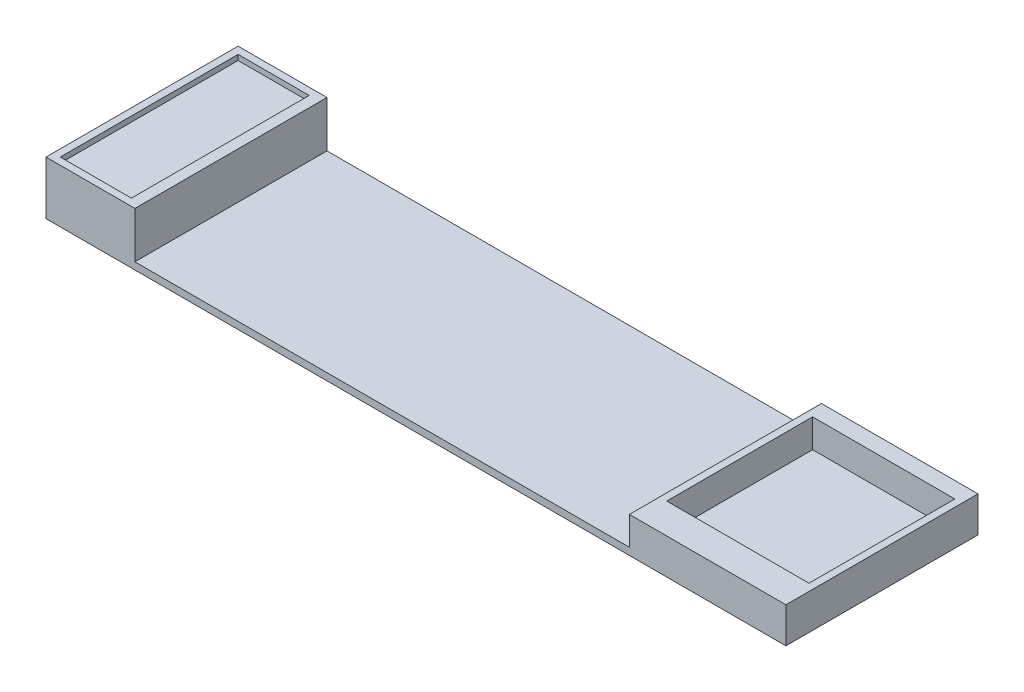
ISO-10303-21;
HEADER;
FILE_DESCRIPTION(('STEP AP214'),'2;1');
FILE_NAME('part.step','',(''),(''),'','','');
FILE_SCHEMA(('AUTOMOTIVE_DESIGN { 1 0 10303 214 1 1 1 1 }'));
ENDSEC;
DATA;
#1=APPLICATION_CONTEXT('core data for automotive mechanical design processes');
#2=APPLICATION_PROTOCOL_DEFINITION('international standard','automotive_design',2000,#1);
#3=PRODUCT_CONTEXT('',#1,'mechanical');
#4=PRODUCT('Part','Part','',(#3));
#5=PRODUCT_RELATED_PRODUCT_CATEGORY('part','',(#4));
#6=PRODUCT_DEFINITION_FORMATION('','',#4);
#7=PRODUCT_DEFINITION_CONTEXT('part definition',#1,'design');
#8=PRODUCT_DEFINITION('design','',#6,#7);
#9=PRODUCT_DEFINITION_SHAPE('','',#8);
#10=(LENGTH_UNIT() NAMED_UNIT(*) SI_UNIT(.MILLI.,.METRE.));
#11=(NAMED_UNIT(*) PLANE_ANGLE_UNIT() SI_UNIT($,.RADIAN.));
#12=(NAMED_UNIT(*) SI_UNIT($,.STERADIAN.) SOLID_ANGLE_UNIT());
#13=UNCERTAINTY_MEASURE_WITH_UNIT(LENGTH_MEASURE(1.E-05),#10,'distance_accuracy_value','');
#14=(GEOMETRIC_REPRESENTATION_CONTEXT(3) GLOBAL_UNCERTAINTY_ASSIGNED_CONTEXT((#13)) GLOBAL_UNIT_ASSIGNED_CONTEXT((#10,
#11,#12)) REPRESENTATION_CONTEXT('',''));
#15=CARTESIAN_POINT('',(0.,0.,0.));
#16=DIRECTION('',(0.,0.,1.));
#17=DIRECTION('',(1.,0.,0.));
#18=AXIS2_PLACEMENT_3D('',#15,#16,#17);
#19=CARTESIAN_POINT('',(0.,10.,0.));
#20=DIRECTION('',(0.,1.,0.));
#21=DIRECTION('',(0.,0.,1.));
#22=AXIS2_PLACEMENT_3D('',#19,#20,#21);
#23=PLANE('',#22);
#24=DIRECTION('',(0.,0.,1.));
#25=VECTOR('',#24,1.);
#26=CARTESIAN_POINT('',(62.,10.,18.5));
#27=LINE('',#26,#25);
#28=CARTESIAN_POINT('',(62.,10.,-22.5));
#29=VERTEX_POINT('',#28);
#30=CARTESIAN_POINT('',(62.,10.,18.5));
#31=VERTEX_POINT('',#30);
#32=EDGE_CURVE('E63',#29,#31,#27,.T.);
#33=ORIENTED_EDGE('',*,*,#32,.F.);
#34=DIRECTION('',(-1.,0.,0.));
#35=VECTOR('',#34,1.);
#36=CARTESIAN_POINT('',(102.,10.,-22.5));
#37=LINE('',#36,#35);
#38=CARTESIAN_POINT('',(102.,10.,-22.5));
#39=VERTEX_POINT('',#38);
#40=EDGE_CURVE('E224',#39,#29,#37,.T.);
#41=ORIENTED_EDGE('',*,*,#40,.F.);
#42=DIRECTION('',(0.,0.,-1.));
#43=VECTOR('',#42,1.);
#44=CARTESIAN_POINT('',(102.,10.,18.5));
#45=LINE('',#44,#43);
#46=CARTESIAN_POINT('',(102.,10.,18.5));
#47=VERTEX_POINT('',#46);
#48=EDGE_CURVE('E243',#47,#39,#45,.T.);
#49=ORIENTED_EDGE('',*,*,#48,.F.);
#50=DIRECTION('',(1.,0.,0.));
#51=VECTOR('',#50,1.);
#52=CARTESIAN_POINT('',(102.,10.,18.5));
#53=LINE('',#52,#51);
#54=EDGE_CURVE('E239',#31,#47,#53,.T.);
#55=ORIENTED_EDGE('',*,*,#54,.F.);
#56=EDGE_LOOP('',(#33,#41,#49,#55));
#57=FACE_BOUND('',#56,.T.);
#58=DIRECTION('',(0.,0.,-1.));
#59=VECTOR('',#58,1.);
#60=CARTESIAN_POINT('',(60.,10.,27.));
#61=LINE('',#60,#59);
#62=CARTESIAN_POINT('',(60.,10.,27.));
#63=VERTEX_POINT('',#62);
#64=CARTESIAN_POINT('',(60.,10.,-27.));
#65=VERTEX_POINT('',#64);
#66=EDGE_CURVE('E253',#63,#65,#61,.T.);
#67=ORIENTED_EDGE('',*,*,#66,.F.);
#68=DIRECTION('',(1.,0.,0.));
#69=VECTOR('',#68,1.);
#70=CARTESIAN_POINT('',(104.,10.,27.));
#71=LINE('',#70,#69);
#72=CARTESIAN_POINT('',(104.,10.,27.));
#73=VERTEX_POINT('',#72);
#74=EDGE_CURVE('E294',#63,#73,#71,.T.);
#75=ORIENTED_EDGE('',*,*,#74,.T.);
#76=DIRECTION('',(0.,0.,-1.));
#77=VECTOR('',#76,1.);
#78=CARTESIAN_POINT('',(104.,10.,27.));
#79=LINE('',#78,#77);
#80=CARTESIAN_POINT('',(104.,10.,-27.));
#81=VERTEX_POINT('',#80);
#82=EDGE_CURVE('E297',#73,#81,#79,.T.);
#83=ORIENTED_EDGE('',*,*,#82,.T.);
#84=DIRECTION('',(-1.,0.,0.));
#85=VECTOR('',#84,1.);
#86=CARTESIAN_POINT('',(104.,10.,-27.));
#87=LINE('',#86,#85);
#88=EDGE_CURVE('E301',#81,#65,#87,.T.);
#89=ORIENTED_EDGE('',*,*,#88,.T.);
#90=EDGE_LOOP('',(#67,#75,#83,#89));
#91=FACE_BOUND('',#90,.T.);
#92=ADVANCED_FACE('F39',(#57,#91),#23,.T.);
#93=CARTESIAN_POINT('',(-104.,10.,27.));
#94=DIRECTION('',(1.,0.,0.));
#95=DIRECTION('',(0.,0.,-1.));
#96=AXIS2_PLACEMENT_3D('',#93,#94,#95);
#97=PLANE('',#96);
#98=DIRECTION('',(0.,0.,1.));
#99=VECTOR('',#98,1.);
#100=CARTESIAN_POINT('',(-104.,0.,27.));
#101=LINE('',#100,#99);
#102=CARTESIAN_POINT('',(-104.,0.,-27.));
#103=VERTEX_POINT('',#102);
#104=CARTESIAN_POINT('',(-104.,0.,27.));
#105=VERTEX_POINT('',#104);
#106=EDGE_CURVE('E284',#103,#105,#101,.T.);
#107=ORIENTED_EDGE('',*,*,#106,.T.);
#108=DIRECTION('',(0.,-1.,0.));
#109=VECTOR('',#108,1.);
#110=CARTESIAN_POINT('',(-104.,10.,27.));
#111=LINE('',#110,#109);
#112=CARTESIAN_POINT('',(-104.,15.,27.));
#113=VERTEX_POINT('',#112);
#114=EDGE_CURVE('E11',#113,#105,#111,.T.);
#115=ORIENTED_EDGE('',*,*,#114,.F.);
#116=DIRECTION('',(0.,0.,1.));
#117=VECTOR('',#116,1.);
#118=CARTESIAN_POINT('',(-104.,15.,27.));
#119=LINE('',#118,#117);
#120=CARTESIAN_POINT('',(-104.,15.,-27.));
#121=VERTEX_POINT('',#120);
#122=EDGE_CURVE('E198',#121,#113,#119,.T.);
#123=ORIENTED_EDGE('',*,*,#122,.F.);
#124=DIRECTION('',(0.,-1.,0.));
#125=VECTOR('',#124,1.);
#126=CARTESIAN_POINT('',(-104.,10.,-27.));
#127=LINE('',#126,#125);
#128=EDGE_CURVE('E305',#121,#103,#127,.T.);
#129=ORIENTED_EDGE('',*,*,#128,.T.);
#130=EDGE_LOOP('',(#107,#115,#123,#129));
#131=FACE_BOUND('',#130,.T.);
#132=ADVANCED_FACE('F41',(#131),#97,.F.);
#133=CARTESIAN_POINT('',(104.,10.,27.));
#134=DIRECTION('',(0.,0.,-1.));
#135=DIRECTION('',(-1.,0.,0.));
#136=AXIS2_PLACEMENT_3D('',#133,#134,#135);
#137=PLANE('',#136);
#138=ORIENTED_EDGE('',*,*,#74,.F.);
#139=DIRECTION('',(0.,1.,0.));
#140=VECTOR('',#139,1.);
#141=CARTESIAN_POINT('',(60.,2.,27.));
#142=LINE('',#141,#140);
#143=CARTESIAN_POINT('',(60.,2.,27.));
#144=VERTEX_POINT('',#143);
#145=EDGE_CURVE('E281',#144,#63,#142,.T.);
#146=ORIENTED_EDGE('',*,*,#145,.F.);
#147=DIRECTION('',(1.,0.,0.));
#148=VECTOR('',#147,1.);
#149=CARTESIAN_POINT('',(-79.,2.,27.));
#150=LINE('',#149,#148);
#151=CARTESIAN_POINT('',(-79.,2.,27.));
#152=VERTEX_POINT('',#151);
#153=EDGE_CURVE('E274',#152,#144,#150,.T.);
#154=ORIENTED_EDGE('',*,*,#153,.F.);
#155=DIRECTION('',(0.,1.,0.));
#156=VECTOR('',#155,1.);
#157=CARTESIAN_POINT('',(-79.,2.,27.));
#158=LINE('',#157,#156);
#159=CARTESIAN_POINT('',(-79.,15.,27.));
#160=VERTEX_POINT('',#159);
#161=EDGE_CURVE('E285',#152,#160,#158,.T.);
#162=ORIENTED_EDGE('',*,*,#161,.T.);
#163=DIRECTION('',(1.,0.,0.));
#164=VECTOR('',#163,1.);
#165=CARTESIAN_POINT('',(-79.,15.,27.));
#166=LINE('',#165,#164);
#167=EDGE_CURVE('E207',#113,#160,#166,.T.);
#168=ORIENTED_EDGE('',*,*,#167,.F.);
#169=ORIENTED_EDGE('',*,*,#114,.T.);
#170=DIRECTION('',(1.,0.,0.));
#171=VECTOR('',#170,1.);
#172=CARTESIAN_POINT('',(104.,0.,27.));
#173=LINE('',#172,#171);
#174=CARTESIAN_POINT('',(104.,0.,27.));
#175=VERTEX_POINT('',#174);
#176=EDGE_CURVE('E309',#105,#175,#173,.T.);
#177=ORIENTED_EDGE('',*,*,#176,.T.);
#178=DIRECTION('',(0.,-1.,0.));
#179=VECTOR('',#178,1.);
#180=CARTESIAN_POINT('',(104.,10.,27.));
#181=LINE('',#180,#179);
#182=EDGE_CURVE('E48',#73,#175,#181,.T.);
#183=ORIENTED_EDGE('',*,*,#182,.F.);
#184=EDGE_LOOP('',(#138,#146,#154,#162,#168,#169,#177,#183));
#185=FACE_BOUND('',#184,.T.);
#186=ADVANCED_FACE('F359',(#185),#137,.F.);
#187=CARTESIAN_POINT('',(104.,10.,27.));
#188=DIRECTION('',(-1.,0.,0.));
#189=DIRECTION('',(0.,0.,1.));
#190=AXIS2_PLACEMENT_3D('',#187,#188,#189);
#191=PLANE('',#190);
#192=DIRECTION('',(0.,0.,-1.));
#193=VECTOR('',#192,1.);
#194=CARTESIAN_POINT('',(104.,0.,27.));
#195=LINE('',#194,#193);
#196=CARTESIAN_POINT('',(104.,0.,-27.));
#197=VERTEX_POINT('',#196);
#198=EDGE_CURVE('E312',#175,#197,#195,.T.);
#199=ORIENTED_EDGE('',*,*,#198,.T.);
#200=DIRECTION('',(0.,-1.,0.));
#201=VECTOR('',#200,1.);
#202=CARTESIAN_POINT('',(104.,10.,-27.));
#203=LINE('',#202,#201);
#204=EDGE_CURVE('E320',#81,#197,#203,.T.);
#205=ORIENTED_EDGE('',*,*,#204,.F.);
#206=ORIENTED_EDGE('',*,*,#82,.F.);
#207=ORIENTED_EDGE('',*,*,#182,.T.);
#208=EDGE_LOOP('',(#199,#205,#206,#207));
#209=FACE_BOUND('',#208,.T.);
#210=ADVANCED_FACE('F329',(#209),#191,.F.);
#211=CARTESIAN_POINT('',(104.,10.,-27.));
#212=DIRECTION('',(0.,0.,1.));
#213=DIRECTION('',(1.,0.,0.));
#214=AXIS2_PLACEMENT_3D('',#211,#212,#213);
#215=PLANE('',#214);
#216=DIRECTION('',(-1.,0.,0.));
#217=VECTOR('',#216,1.);
#218=CARTESIAN_POINT('',(60.,2.,-27.));
#219=LINE('',#218,#217);
#220=CARTESIAN_POINT('',(60.,2.,-27.));
#221=VERTEX_POINT('',#220);
#222=CARTESIAN_POINT('',(-79.,2.,-27.));
#223=VERTEX_POINT('',#222);
#224=EDGE_CURVE('E266',#221,#223,#219,.T.);
#225=ORIENTED_EDGE('',*,*,#224,.F.);
#226=DIRECTION('',(0.,1.,0.));
#227=VECTOR('',#226,1.);
#228=CARTESIAN_POINT('',(60.,2.,-27.));
#229=LINE('',#228,#227);
#230=EDGE_CURVE('E278',#221,#65,#229,.T.);
#231=ORIENTED_EDGE('',*,*,#230,.T.);
#232=ORIENTED_EDGE('',*,*,#88,.F.);
#233=ORIENTED_EDGE('',*,*,#204,.T.);
#234=DIRECTION('',(-1.,0.,0.));
#235=VECTOR('',#234,1.);
#236=CARTESIAN_POINT('',(104.,0.,-27.));
#237=LINE('',#236,#235);
#238=EDGE_CURVE('E298',#197,#103,#237,.T.);
#239=ORIENTED_EDGE('',*,*,#238,.T.);
#240=ORIENTED_EDGE('',*,*,#128,.F.);
#241=DIRECTION('',(-1.,0.,0.));
#242=VECTOR('',#241,1.);
#243=CARTESIAN_POINT('',(-104.,15.,-27.));
#244=LINE('',#243,#242);
#245=CARTESIAN_POINT('',(-79.,15.,-27.));
#246=VERTEX_POINT('',#245);
#247=EDGE_CURVE('E215',#246,#121,#244,.T.);
#248=ORIENTED_EDGE('',*,*,#247,.F.);
#249=DIRECTION('',(0.,1.,0.));
#250=VECTOR('',#249,1.);
#251=CARTESIAN_POINT('',(-79.,2.,-27.));
#252=LINE('',#251,#250);
#253=EDGE_CURVE('E288',#223,#246,#252,.T.);
#254=ORIENTED_EDGE('',*,*,#253,.F.);
#255=EDGE_LOOP('',(#225,#231,#232,#233,#239,#240,#248,#254));
#256=FACE_BOUND('',#255,.T.);
#257=ADVANCED_FACE('F339',(#256),#215,.F.);
#258=CARTESIAN_POINT('',(0.,0.,0.));
#259=DIRECTION('',(0.,1.,0.));
#260=DIRECTION('',(0.,0.,1.));
#261=AXIS2_PLACEMENT_3D('',#258,#259,#260);
#262=PLANE('',#261);
#263=ORIENTED_EDGE('',*,*,#106,.F.);
#264=ORIENTED_EDGE('',*,*,#238,.F.);
#265=ORIENTED_EDGE('',*,*,#198,.F.);
#266=ORIENTED_EDGE('',*,*,#176,.F.);
#267=EDGE_LOOP('',(#263,#264,#265,#266));
#268=FACE_BOUND('',#267,.T.);
#269=ADVANCED_FACE('F336',(#268),#262,.F.);
#270=CARTESIAN_POINT('',(60.,2.,27.));
#271=DIRECTION('',(1.,0.,0.));
#272=DIRECTION('',(0.,0.,-1.));
#273=AXIS2_PLACEMENT_3D('',#270,#271,#272);
#274=PLANE('',#273);
#275=ORIENTED_EDGE('',*,*,#66,.T.);
#276=ORIENTED_EDGE('',*,*,#230,.F.);
#277=DIRECTION('',(0.,0.,-1.));
#278=VECTOR('',#277,1.);
#279=CARTESIAN_POINT('',(60.,2.,27.));
#280=LINE('',#279,#278);
#281=EDGE_CURVE('E262',#144,#221,#280,.T.);
#282=ORIENTED_EDGE('',*,*,#281,.F.);
#283=ORIENTED_EDGE('',*,*,#145,.T.);
#284=EDGE_LOOP('',(#275,#276,#282,#283));
#285=FACE_BOUND('',#284,.T.);
#286=ADVANCED_FACE('F356',(#285),#274,.F.);
#287=CARTESIAN_POINT('',(-79.,2.,-27.));
#288=DIRECTION('',(-1.,0.,0.));
#289=DIRECTION('',(0.,0.,1.));
#290=AXIS2_PLACEMENT_3D('',#287,#288,#289);
#291=PLANE('',#290);
#292=ORIENTED_EDGE('',*,*,#253,.T.);
#293=DIRECTION('',(0.,0.,-1.));
#294=VECTOR('',#293,1.);
#295=CARTESIAN_POINT('',(-79.,15.,-27.));
#296=LINE('',#295,#294);
#297=EDGE_CURVE('E211',#160,#246,#296,.T.);
#298=ORIENTED_EDGE('',*,*,#297,.F.);
#299=ORIENTED_EDGE('',*,*,#161,.F.);
#300=DIRECTION('',(0.,0.,1.));
#301=VECTOR('',#300,1.);
#302=CARTESIAN_POINT('',(-79.,2.,-27.));
#303=LINE('',#302,#301);
#304=EDGE_CURVE('E270',#223,#152,#303,.T.);
#305=ORIENTED_EDGE('',*,*,#304,.F.);
#306=EDGE_LOOP('',(#292,#298,#299,#305));
#307=FACE_BOUND('',#306,.T.);
#308=ADVANCED_FACE('F350',(#307),#291,.F.);
#309=CARTESIAN_POINT('',(0.,2.,0.));
#310=DIRECTION('',(0.,1.,0.));
#311=DIRECTION('',(0.,0.,1.));
#312=AXIS2_PLACEMENT_3D('',#309,#310,#311);
#313=PLANE('',#312);
#314=ORIENTED_EDGE('',*,*,#281,.T.);
#315=ORIENTED_EDGE('',*,*,#224,.T.);
#316=ORIENTED_EDGE('',*,*,#304,.T.);
#317=ORIENTED_EDGE('',*,*,#153,.T.);
#318=EDGE_LOOP('',(#314,#315,#316,#317));
#319=FACE_BOUND('',#318,.T.);
#320=ADVANCED_FACE('F353',(#319),#313,.T.);
#321=CARTESIAN_POINT('',(62.,2.,18.5));
#322=DIRECTION('',(-1.,0.,0.));
#323=DIRECTION('',(0.,0.,1.));
#324=AXIS2_PLACEMENT_3D('',#321,#322,#323);
#325=PLANE('',#324);
#326=ORIENTED_EDGE('',*,*,#32,.T.);
#327=DIRECTION('',(0.,1.,0.));
#328=VECTOR('',#327,1.);
#329=CARTESIAN_POINT('',(62.,2.,18.5));
#330=LINE('',#329,#328);
#331=CARTESIAN_POINT('',(62.,2.,18.5));
#332=VERTEX_POINT('',#331);
#333=EDGE_CURVE('E236',#332,#31,#330,.T.);
#334=ORIENTED_EDGE('',*,*,#333,.F.);
#335=DIRECTION('',(0.,0.,1.));
#336=VECTOR('',#335,1.);
#337=CARTESIAN_POINT('',(62.,2.,18.5));
#338=LINE('',#337,#336);
#339=CARTESIAN_POINT('',(62.,2.,-22.5));
#340=VERTEX_POINT('',#339);
#341=EDGE_CURVE('E219',#340,#332,#338,.T.);
#342=ORIENTED_EDGE('',*,*,#341,.F.);
#343=DIRECTION('',(0.,1.,0.));
#344=VECTOR('',#343,1.);
#345=CARTESIAN_POINT('',(62.,2.,-22.5));
#346=LINE('',#345,#344);
#347=EDGE_CURVE('E250',#340,#29,#346,.T.);
#348=ORIENTED_EDGE('',*,*,#347,.T.);
#349=EDGE_LOOP('',(#326,#334,#342,#348));
#350=FACE_BOUND('',#349,.T.);
#351=ADVANCED_FACE('F402',(#350),#325,.F.);
#352=CARTESIAN_POINT('',(102.,2.,-22.5));
#353=DIRECTION('',(0.,0.,-1.));
#354=DIRECTION('',(-1.,0.,0.));
#355=AXIS2_PLACEMENT_3D('',#352,#353,#354);
#356=PLANE('',#355);
#357=ORIENTED_EDGE('',*,*,#40,.T.);
#358=ORIENTED_EDGE('',*,*,#347,.F.);
#359=DIRECTION('',(-1.,0.,0.));
#360=VECTOR('',#359,1.);
#361=CARTESIAN_POINT('',(102.,2.,-22.5));
#362=LINE('',#361,#360);
#363=CARTESIAN_POINT('',(102.,2.,-22.5));
#364=VERTEX_POINT('',#363);
#365=EDGE_CURVE('E232',#364,#340,#362,.T.);
#366=ORIENTED_EDGE('',*,*,#365,.F.);
#367=DIRECTION('',(0.,1.,0.));
#368=VECTOR('',#367,1.);
#369=CARTESIAN_POINT('',(102.,2.,-22.5));
#370=LINE('',#369,#368);
#371=EDGE_CURVE('E254',#364,#39,#370,.T.);
#372=ORIENTED_EDGE('',*,*,#371,.T.);
#373=EDGE_LOOP('',(#357,#358,#366,#372));
#374=FACE_BOUND('',#373,.T.);
#375=ADVANCED_FACE('F409',(#374),#356,.F.);
#376=CARTESIAN_POINT('',(102.,2.,18.5));
#377=DIRECTION('',(1.,0.,0.));
#378=DIRECTION('',(0.,0.,-1.));
#379=AXIS2_PLACEMENT_3D('',#376,#377,#378);
#380=PLANE('',#379);
#381=ORIENTED_EDGE('',*,*,#48,.T.);
#382=ORIENTED_EDGE('',*,*,#371,.F.);
#383=DIRECTION('',(0.,0.,-1.));
#384=VECTOR('',#383,1.);
#385=CARTESIAN_POINT('',(102.,2.,18.5));
#386=LINE('',#385,#384);
#387=CARTESIAN_POINT('',(102.,2.,18.5));
#388=VERTEX_POINT('',#387);
#389=EDGE_CURVE('E228',#388,#364,#386,.T.);
#390=ORIENTED_EDGE('',*,*,#389,.F.);
#391=DIRECTION('',(0.,1.,0.));
#392=VECTOR('',#391,1.);
#393=CARTESIAN_POINT('',(102.,2.,18.5));
#394=LINE('',#393,#392);
#395=EDGE_CURVE('E257',#388,#47,#394,.T.);
#396=ORIENTED_EDGE('',*,*,#395,.T.);
#397=EDGE_LOOP('',(#381,#382,#390,#396));
#398=FACE_BOUND('',#397,.T.);
#399=ADVANCED_FACE('F416',(#398),#380,.F.);
#400=CARTESIAN_POINT('',(102.,2.,18.5));
#401=DIRECTION('',(0.,0.,1.));
#402=DIRECTION('',(1.,0.,0.));
#403=AXIS2_PLACEMENT_3D('',#400,#401,#402);
#404=PLANE('',#403);
#405=ORIENTED_EDGE('',*,*,#54,.T.);
#406=ORIENTED_EDGE('',*,*,#395,.F.);
#407=DIRECTION('',(1.,0.,0.));
#408=VECTOR('',#407,1.);
#409=CARTESIAN_POINT('',(102.,2.,18.5));
#410=LINE('',#409,#408);
#411=EDGE_CURVE('E223',#332,#388,#410,.T.);
#412=ORIENTED_EDGE('',*,*,#411,.F.);
#413=ORIENTED_EDGE('',*,*,#333,.T.);
#414=EDGE_LOOP('',(#405,#406,#412,#413));
#415=FACE_BOUND('',#414,.T.);
#416=ADVANCED_FACE('F424',(#415),#404,.F.);
#417=CARTESIAN_POINT('',(0.,2.,0.));
#418=DIRECTION('',(0.,1.,0.));
#419=DIRECTION('',(0.,0.,1.));
#420=AXIS2_PLACEMENT_3D('',#417,#418,#419);
#421=PLANE('',#420);
#422=ORIENTED_EDGE('',*,*,#341,.T.);
#423=ORIENTED_EDGE('',*,*,#411,.T.);
#424=ORIENTED_EDGE('',*,*,#389,.T.);
#425=ORIENTED_EDGE('',*,*,#365,.T.);
#426=EDGE_LOOP('',(#422,#423,#424,#425));
#427=FACE_BOUND('',#426,.T.);
#428=ADVANCED_FACE('F432',(#427),#421,.T.);
#429=CARTESIAN_POINT('',(0.,15.,0.));
#430=DIRECTION('',(0.,-1.,0.));
#431=DIRECTION('',(0.,0.,-1.));
#432=AXIS2_PLACEMENT_3D('',#429,#430,#431);
#433=PLANE('',#432);
#434=DIRECTION('',(-1.,0.,0.));
#435=VECTOR('',#434,1.);
#436=CARTESIAN_POINT('',(-102.,15.,-25.));
#437=LINE('',#436,#435);
#438=CARTESIAN_POINT('',(-82.,15.,-25.));
#439=VERTEX_POINT('',#438);
#440=CARTESIAN_POINT('',(-102.,15.,-25.));
#441=VERTEX_POINT('',#440);
#442=EDGE_CURVE('E189',#439,#441,#437,.T.);
#443=ORIENTED_EDGE('',*,*,#442,.F.);
#444=DIRECTION('',(0.,0.,-1.));
#445=VECTOR('',#444,1.);
#446=CARTESIAN_POINT('',(-82.,15.,25.));
#447=LINE('',#446,#445);
#448=CARTESIAN_POINT('',(-82.,15.,25.));
#449=VERTEX_POINT('',#448);
#450=EDGE_CURVE('E55',#449,#439,#447,.T.);
#451=ORIENTED_EDGE('',*,*,#450,.F.);
#452=DIRECTION('',(1.,0.,0.));
#453=VECTOR('',#452,1.);
#454=CARTESIAN_POINT('',(-102.,15.,25.));
#455=LINE('',#454,#453);
#456=CARTESIAN_POINT('',(-102.,15.,25.));
#457=VERTEX_POINT('',#456);
#458=EDGE_CURVE('E176',#457,#449,#455,.T.);
#459=ORIENTED_EDGE('',*,*,#458,.F.);
#460=DIRECTION('',(0.,0.,1.));
#461=VECTOR('',#460,1.);
#462=CARTESIAN_POINT('',(-102.,15.,25.));
#463=LINE('',#462,#461);
#464=EDGE_CURVE('E180',#441,#457,#463,.T.);
#465=ORIENTED_EDGE('',*,*,#464,.F.);
#466=EDGE_LOOP('',(#443,#451,#459,#465));
#467=FACE_BOUND('',#466,.T.);
#468=ORIENTED_EDGE('',*,*,#122,.T.);
#469=ORIENTED_EDGE('',*,*,#167,.T.);
#470=ORIENTED_EDGE('',*,*,#297,.T.);
#471=ORIENTED_EDGE('',*,*,#247,.T.);
#472=EDGE_LOOP('',(#468,#469,#470,#471));
#473=FACE_BOUND('',#472,.T.);
#474=ADVANCED_FACE('F346',(#467,#473),#433,.F.);
#475=CARTESIAN_POINT('',(-82.,13.5,25.));
#476=DIRECTION('',(1.,0.,0.));
#477=DIRECTION('',(0.,0.,-1.));
#478=AXIS2_PLACEMENT_3D('',#475,#476,#477);
#479=PLANE('',#478);
#480=ORIENTED_EDGE('',*,*,#450,.T.);
#481=DIRECTION('',(0.,1.,0.));
#482=VECTOR('',#481,1.);
#483=CARTESIAN_POINT('',(-82.,13.5,-25.));
#484=LINE('',#483,#482);
#485=CARTESIAN_POINT('',(-82.,13.5,-25.));
#486=VERTEX_POINT('',#485);
#487=EDGE_CURVE('E151',#486,#439,#484,.T.);
#488=ORIENTED_EDGE('',*,*,#487,.F.);
#489=DIRECTION('',(0.,0.,-1.));
#490=VECTOR('',#489,1.);
#491=CARTESIAN_POINT('',(-82.,13.5,25.));
#492=LINE('',#491,#490);
#493=CARTESIAN_POINT('',(-82.,13.5,25.));
#494=VERTEX_POINT('',#493);
#495=EDGE_CURVE('E155',#494,#486,#492,.T.);
#496=ORIENTED_EDGE('',*,*,#495,.F.);
#497=DIRECTION('',(0.,1.,0.));
#498=VECTOR('',#497,1.);
#499=CARTESIAN_POINT('',(-82.,13.5,25.));
#500=LINE('',#499,#498);
#501=EDGE_CURVE('E195',#494,#449,#500,.T.);
#502=ORIENTED_EDGE('',*,*,#501,.T.);
#503=EDGE_LOOP('',(#480,#488,#496,#502));
#504=FACE_BOUND('',#503,.T.);
#505=ADVANCED_FACE('F153',(#504),#479,.F.);
#506=CARTESIAN_POINT('',(-102.,13.5,25.));
#507=DIRECTION('',(0.,0.,1.));
#508=DIRECTION('',(1.,0.,0.));
#509=AXIS2_PLACEMENT_3D('',#506,#507,#508);
#510=PLANE('',#509);
#511=ORIENTED_EDGE('',*,*,#458,.T.);
#512=ORIENTED_EDGE('',*,*,#501,.F.);
#513=DIRECTION('',(1.,0.,0.));
#514=VECTOR('',#513,1.);
#515=CARTESIAN_POINT('',(-102.,13.5,25.));
#516=LINE('',#515,#514);
#517=CARTESIAN_POINT('',(-102.,13.5,25.));
#518=VERTEX_POINT('',#517);
#519=EDGE_CURVE('E162',#518,#494,#516,.T.);
#520=ORIENTED_EDGE('',*,*,#519,.F.);
#521=DIRECTION('',(0.,1.,0.));
#522=VECTOR('',#521,1.);
#523=CARTESIAN_POINT('',(-102.,13.5,25.));
#524=LINE('',#523,#522);
#525=EDGE_CURVE('E199',#518,#457,#524,.T.);
#526=ORIENTED_EDGE('',*,*,#525,.T.);
#527=EDGE_LOOP('',(#511,#512,#520,#526));
#528=FACE_BOUND('',#527,.T.);
#529=ADVANCED_FACE('F454',(#528),#510,.F.);
#530=CARTESIAN_POINT('',(-102.,13.5,25.));
#531=DIRECTION('',(-1.,0.,0.));
#532=DIRECTION('',(0.,0.,1.));
#533=AXIS2_PLACEMENT_3D('',#530,#531,#532);
#534=PLANE('',#533);
#535=ORIENTED_EDGE('',*,*,#464,.T.);
#536=ORIENTED_EDGE('',*,*,#525,.F.);
#537=DIRECTION('',(0.,0.,1.));
#538=VECTOR('',#537,1.);
#539=CARTESIAN_POINT('',(-102.,13.5,25.));
#540=LINE('',#539,#538);
#541=CARTESIAN_POINT('',(-102.,13.5,-25.));
#542=VERTEX_POINT('',#541);
#543=EDGE_CURVE('E171',#542,#518,#540,.T.);
#544=ORIENTED_EDGE('',*,*,#543,.F.);
#545=DIRECTION('',(0.,1.,0.));
#546=VECTOR('',#545,1.);
#547=CARTESIAN_POINT('',(-102.,13.5,-25.));
#548=LINE('',#547,#546);
#549=EDGE_CURVE('E161',#542,#441,#548,.T.);
#550=ORIENTED_EDGE('',*,*,#549,.T.);
#551=EDGE_LOOP('',(#535,#536,#544,#550));
#552=FACE_BOUND('',#551,.T.);
#553=ADVANCED_FACE('F461',(#552),#534,.F.);
#554=CARTESIAN_POINT('',(-102.,13.5,-25.));
#555=DIRECTION('',(0.,0.,-1.));
#556=DIRECTION('',(-1.,0.,0.));
#557=AXIS2_PLACEMENT_3D('',#554,#555,#556);
#558=PLANE('',#557);
#559=ORIENTED_EDGE('',*,*,#442,.T.);
#560=ORIENTED_EDGE('',*,*,#549,.F.);
#561=DIRECTION('',(-1.,0.,0.));
#562=VECTOR('',#561,1.);
#563=CARTESIAN_POINT('',(-102.,13.5,-25.));
#564=LINE('',#563,#562);
#565=EDGE_CURVE('E165',#486,#542,#564,.T.);
#566=ORIENTED_EDGE('',*,*,#565,.F.);
#567=ORIENTED_EDGE('',*,*,#487,.T.);
#568=EDGE_LOOP('',(#559,#560,#566,#567));
#569=FACE_BOUND('',#568,.T.);
#570=ADVANCED_FACE('F166',(#569),#558,.F.);
#571=CARTESIAN_POINT('',(0.,13.5,0.));
#572=DIRECTION('',(0.,-1.,0.));
#573=DIRECTION('',(0.,0.,-1.));
#574=AXIS2_PLACEMENT_3D('',#571,#572,#573);
#575=PLANE('',#574);
#576=ORIENTED_EDGE('',*,*,#495,.T.);
#577=ORIENTED_EDGE('',*,*,#565,.T.);
#578=ORIENTED_EDGE('',*,*,#543,.T.);
#579=ORIENTED_EDGE('',*,*,#519,.T.);
#580=EDGE_LOOP('',(#576,#577,#578,#579));
#581=FACE_BOUND('',#580,.T.);
#582=ADVANCED_FACE('F173',(#581),#575,.F.);
#583=CLOSED_SHELL('',(#92,#132,#186,#210,#257,#269,#286,#308,#320,#351,#375,#399,#416,#428,#474,
#505,#529,#553,#570,#582));
#584=MANIFOLD_SOLID_BREP('B2',#583);
#585=ADVANCED_BREP_SHAPE_REPRESENTATION('',(#18,#584),#14);
#586=SHAPE_DEFINITION_REPRESENTATION(#9,#585);
ENDSEC;
END-ISO-10303-21;
